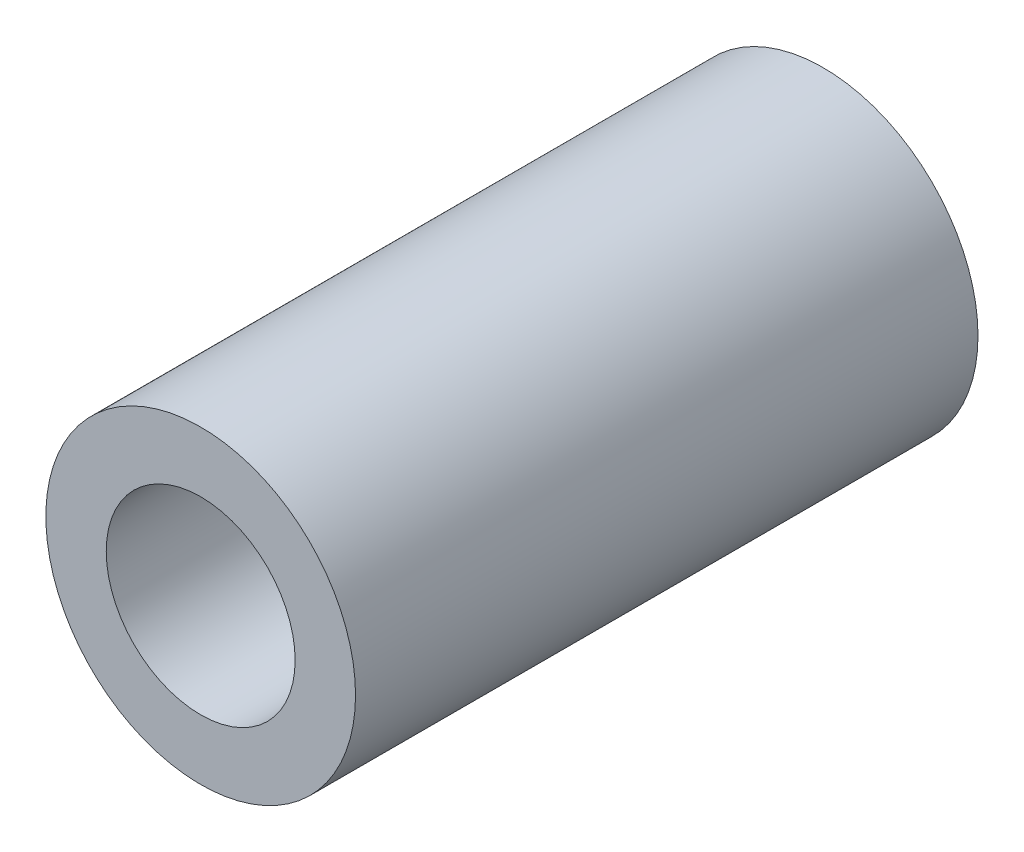
ISO-10303-21;
HEADER;
FILE_DESCRIPTION(('STEP AP214'),'2;1');
FILE_NAME('part.step','',(''),(''),'','','');
FILE_SCHEMA(('AUTOMOTIVE_DESIGN { 1 0 10303 214 1 1 1 1 }'));
ENDSEC;
DATA;
#1=APPLICATION_CONTEXT('core data for automotive mechanical design processes');
#2=APPLICATION_PROTOCOL_DEFINITION('international standard','automotive_design',2000,#1);
#3=PRODUCT_CONTEXT('',#1,'mechanical');
#4=PRODUCT('Part','Part','',(#3));
#5=PRODUCT_RELATED_PRODUCT_CATEGORY('part','',(#4));
#6=PRODUCT_DEFINITION_FORMATION('','',#4);
#7=PRODUCT_DEFINITION_CONTEXT('part definition',#1,'design');
#8=PRODUCT_DEFINITION('design','',#6,#7);
#9=PRODUCT_DEFINITION_SHAPE('','',#8);
#10=(LENGTH_UNIT() NAMED_UNIT(*) SI_UNIT(.MILLI.,.METRE.));
#11=(NAMED_UNIT(*) PLANE_ANGLE_UNIT() SI_UNIT($,.RADIAN.));
#12=(NAMED_UNIT(*) SI_UNIT($,.STERADIAN.) SOLID_ANGLE_UNIT());
#13=UNCERTAINTY_MEASURE_WITH_UNIT(LENGTH_MEASURE(1.E-05),#10,'distance_accuracy_value','');
#14=(GEOMETRIC_REPRESENTATION_CONTEXT(3) GLOBAL_UNCERTAINTY_ASSIGNED_CONTEXT((#13)) GLOBAL_UNIT_ASSIGNED_CONTEXT((#10,
#11,#12)) REPRESENTATION_CONTEXT('',''));
#15=CARTESIAN_POINT('',(0.,0.,0.));
#16=DIRECTION('',(0.,0.,1.));
#17=DIRECTION('',(1.,0.,0.));
#18=AXIS2_PLACEMENT_3D('',#15,#16,#17);
#19=CARTESIAN_POINT('',(0.,0.,20.1));
#20=DIRECTION('',(0.,0.,1.));
#21=DIRECTION('',(1.,0.,0.));
#22=AXIS2_PLACEMENT_3D('',#19,#20,#21);
#23=PLANE('',#22);
#24=CARTESIAN_POINT('',(0.,0.,20.1));
#25=DIRECTION('',(0.,0.,1.));
#26=DIRECTION('',(1.,0.,0.));
#27=AXIS2_PLACEMENT_3D('',#24,#25,#26);
#28=CIRCLE('',#27,10.);
#29=CARTESIAN_POINT('',(10.,0.,20.1));
#30=VERTEX_POINT('',#29);
#31=EDGE_CURVE('E10',#30,#30,#28,.T.);
#32=ORIENTED_EDGE('',*,*,#31,.T.);
#33=EDGE_LOOP('',(#32));
#34=FACE_BOUND('',#33,.T.);
#35=CARTESIAN_POINT('',(0.,0.,20.1));
#36=DIRECTION('',(0.,0.,1.));
#37=DIRECTION('',(1.,0.,0.));
#38=AXIS2_PLACEMENT_3D('',#35,#36,#37);
#39=CIRCLE('',#38,6.1);
#40=CARTESIAN_POINT('',(6.1,0.,20.1));
#41=VERTEX_POINT('',#40);
#42=EDGE_CURVE('E50',#41,#41,#39,.T.);
#43=ORIENTED_EDGE('',*,*,#42,.F.);
#44=EDGE_LOOP('',(#43));
#45=FACE_BOUND('',#44,.T.);
#46=ADVANCED_FACE('F37',(#34,#45),#23,.T.);
#47=CARTESIAN_POINT('',(0.,0.,-20.1));
#48=DIRECTION('',(0.,0.,1.));
#49=DIRECTION('',(1.,0.,0.));
#50=AXIS2_PLACEMENT_3D('',#47,#48,#49);
#51=PLANE('',#50);
#52=CARTESIAN_POINT('',(0.,0.,-20.1));
#53=DIRECTION('',(0.,0.,1.));
#54=DIRECTION('',(1.,0.,0.));
#55=AXIS2_PLACEMENT_3D('',#52,#53,#54);
#56=CIRCLE('',#55,10.);
#57=CARTESIAN_POINT('',(10.,0.,-20.1));
#58=VERTEX_POINT('',#57);
#59=EDGE_CURVE('E41',#58,#58,#56,.T.);
#60=ORIENTED_EDGE('',*,*,#59,.F.);
#61=EDGE_LOOP('',(#60));
#62=FACE_BOUND('',#61,.T.);
#63=CARTESIAN_POINT('',(0.,0.,-20.1));
#64=DIRECTION('',(0.,0.,1.));
#65=DIRECTION('',(1.,0.,0.));
#66=AXIS2_PLACEMENT_3D('',#63,#64,#65);
#67=CIRCLE('',#66,6.1);
#68=CARTESIAN_POINT('',(6.1,0.,-20.1));
#69=VERTEX_POINT('',#68);
#70=EDGE_CURVE('E52',#69,#69,#67,.T.);
#71=ORIENTED_EDGE('',*,*,#70,.T.);
#72=EDGE_LOOP('',(#71));
#73=FACE_BOUND('',#72,.T.);
#74=ADVANCED_FACE('F64',(#62,#73),#51,.F.);
#75=CARTESIAN_POINT('',(0.,0.,20.1));
#76=DIRECTION('',(0.,0.,-1.));
#77=DIRECTION('',(-1.,0.,0.));
#78=AXIS2_PLACEMENT_3D('',#75,#76,#77);
#79=CYLINDRICAL_SURFACE('',#78,10.);
#80=ORIENTED_EDGE('',*,*,#31,.F.);
#81=EDGE_LOOP('',(#80));
#82=FACE_BOUND('',#81,.T.);
#83=ORIENTED_EDGE('',*,*,#59,.T.);
#84=EDGE_LOOP('',(#83));
#85=FACE_BOUND('',#84,.T.);
#86=ADVANCED_FACE('F39',(#82,#85),#79,.T.);
#87=CARTESIAN_POINT('',(0.,0.,20.1));
#88=DIRECTION('',(0.,0.,-1.));
#89=DIRECTION('',(-1.,0.,0.));
#90=AXIS2_PLACEMENT_3D('',#87,#88,#89);
#91=CYLINDRICAL_SURFACE('',#90,6.1);
#92=ORIENTED_EDGE('',*,*,#42,.T.);
#93=EDGE_LOOP('',(#92));
#94=FACE_BOUND('',#93,.T.);
#95=ORIENTED_EDGE('',*,*,#70,.F.);
#96=EDGE_LOOP('',(#95));
#97=FACE_BOUND('',#96,.T.);
#98=ADVANCED_FACE('F60',(#94,#97),#91,.F.);
#99=CLOSED_SHELL('',(#46,#74,#86,#98));
#100=MANIFOLD_SOLID_BREP('B2',#99);
#101=ADVANCED_BREP_SHAPE_REPRESENTATION('',(#18,#100),#14);
#102=SHAPE_DEFINITION_REPRESENTATION(#9,#101);
ENDSEC;
END-ISO-10303-21;
